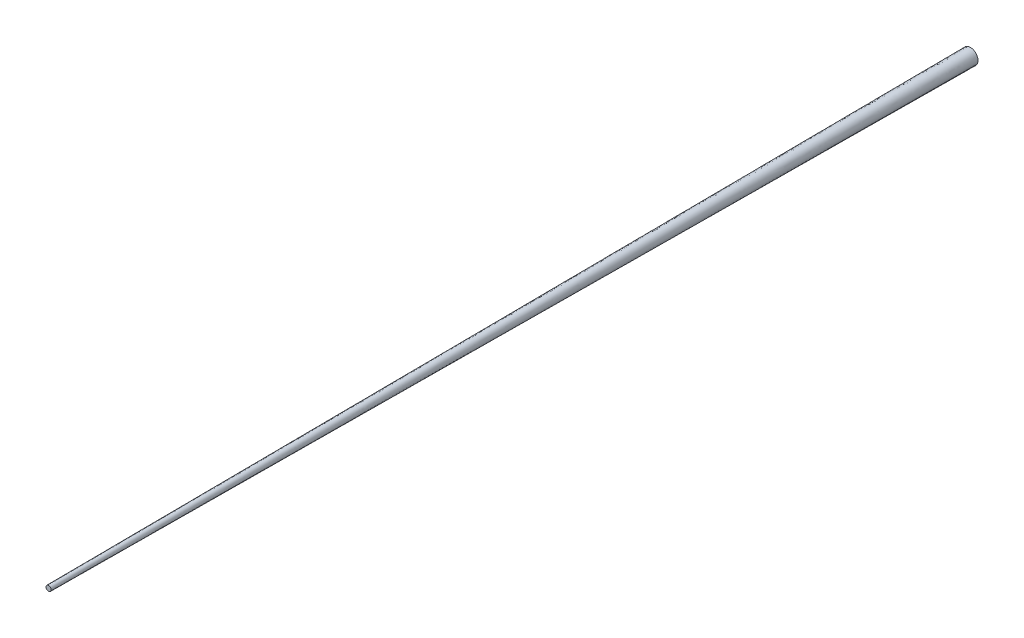
ISO-10303-21;
HEADER;
FILE_DESCRIPTION(('STEP AP214'),'2;1');
FILE_NAME('part.step','',(''),(''),'','','');
FILE_SCHEMA(('AUTOMOTIVE_DESIGN { 1 0 10303 214 1 1 1 1 }'));
ENDSEC;
DATA;
#1=APPLICATION_CONTEXT('core data for automotive mechanical design processes');
#2=APPLICATION_PROTOCOL_DEFINITION('international standard','automotive_design',2000,#1);
#3=PRODUCT_CONTEXT('',#1,'mechanical');
#4=PRODUCT('Part','Part','',(#3));
#5=PRODUCT_RELATED_PRODUCT_CATEGORY('part','',(#4));
#6=PRODUCT_DEFINITION_FORMATION('','',#4);
#7=PRODUCT_DEFINITION_CONTEXT('part definition',#1,'design');
#8=PRODUCT_DEFINITION('design','',#6,#7);
#9=PRODUCT_DEFINITION_SHAPE('','',#8);
#10=(LENGTH_UNIT() NAMED_UNIT(*) SI_UNIT(.MILLI.,.METRE.));
#11=(NAMED_UNIT(*) PLANE_ANGLE_UNIT() SI_UNIT($,.RADIAN.));
#12=(NAMED_UNIT(*) SI_UNIT($,.STERADIAN.) SOLID_ANGLE_UNIT());
#13=UNCERTAINTY_MEASURE_WITH_UNIT(LENGTH_MEASURE(1.E-05),#10,'distance_accuracy_value','');
#14=(GEOMETRIC_REPRESENTATION_CONTEXT(3) GLOBAL_UNCERTAINTY_ASSIGNED_CONTEXT((#13)) GLOBAL_UNIT_ASSIGNED_CONTEXT((#10,
#11,#12)) REPRESENTATION_CONTEXT('',''));
#15=CARTESIAN_POINT('',(0.,0.,0.));
#16=DIRECTION('',(0.,0.,1.));
#17=DIRECTION('',(1.,0.,0.));
#18=AXIS2_PLACEMENT_3D('',#15,#16,#17);
#19=CARTESIAN_POINT('',(0.,0.,31.));
#20=DIRECTION('',(0.,0.,1.));
#21=DIRECTION('',(1.,0.,0.));
#22=AXIS2_PLACEMENT_3D('',#19,#20,#21);
#23=PLANE('',#22);
#24=CARTESIAN_POINT('',(0.,0.,31.));
#25=DIRECTION('',(0.,0.,1.));
#26=DIRECTION('',(1.,0.,0.));
#27=AXIS2_PLACEMENT_3D('',#24,#25,#26);
#28=CIRCLE('',#27,1.5);
#29=CARTESIAN_POINT('',(1.30248005570267,-0.744006521810648,31.));
#30=VERTEX_POINT('',#29);
#31=EDGE_CURVE('E11',#30,#30,#28,.T.);
#32=ORIENTED_EDGE('',*,*,#31,.F.);
#33=EDGE_LOOP('',(#32));
#34=FACE_BOUND('',#33,.T.);
#35=ADVANCED_FACE('F41',(#34),#23,.F.);
#36=CARTESIAN_POINT('',(0.,0.,212.5));
#37=DIRECTION('',(0.,0.,1.));
#38=DIRECTION('',(1.,0.,0.));
#39=AXIS2_PLACEMENT_3D('',#36,#37,#38);
#40=PLANE('',#39);
#41=CARTESIAN_POINT('',(0.,0.,212.5));
#42=DIRECTION('',(0.,0.,1.));
#43=DIRECTION('',(1.,0.,0.));
#44=AXIS2_PLACEMENT_3D('',#41,#42,#43);
#45=CIRCLE('',#44,0.499999999999966);
#46=CARTESIAN_POINT('',(0.305459621935444,-0.395846459333693,212.5));
#47=VERTEX_POINT('',#46);
#48=EDGE_CURVE('E49',#47,#47,#45,.T.);
#49=ORIENTED_EDGE('',*,*,#48,.T.);
#50=EDGE_LOOP('',(#49));
#51=FACE_BOUND('',#50,.T.);
#52=ADVANCED_FACE('F73',(#51),#40,.T.);
#53=CARTESIAN_POINT('',(0.305459621935444,-0.395846459333693,212.5));
#54=CARTESIAN_POINT('',(1.30248005570267,-0.744006521810648,31.));
#55=CARTESIAN_POINT('',(-0.486233296731943,-1.00676570320458,212.5));
#56=CARTESIAN_POINT('',(-0.185532987918629,-3.34896663321598,31.));
#57=CARTESIAN_POINT('',(-1.09715254060283,-0.215072784537195,212.5));
#58=CARTESIAN_POINT('',(-2.79049309932396,-1.86095358959469,31.));
#59=CARTESIAN_POINT('',(-0.305459621935444,0.395846459333693,212.5));
#60=CARTESIAN_POINT('',(-1.30248005570267,0.744006521810648,31.));
#61=CARTESIAN_POINT('',(0.486233296731942,1.00676570320458,212.5));
#62=CARTESIAN_POINT('',(0.18553298791863,3.34896663321598,31.));
#63=CARTESIAN_POINT('',(1.09715254060283,0.215072784537195,212.5));
#64=CARTESIAN_POINT('',(2.79049309932397,1.86095358959468,31.));
#65=CARTESIAN_POINT('',(0.305459621935444,-0.395846459333693,212.5));
#66=CARTESIAN_POINT('',(1.30248005570267,-0.744006521810648,31.));
#67=(BOUNDED_SURFACE() B_SPLINE_SURFACE(3,1,((#53,#54),(#55,#56),(#57,#58),(#59,#60),(#61,#62),
(#63,#64),(#65,#66)),.UNSPECIFIED.,.T.,.F.,.F.) B_SPLINE_SURFACE_WITH_KNOTS((4,3,4),(2,2),(0.,
0.5,1.),(0.,1.),.UNSPECIFIED.) GEOMETRIC_REPRESENTATION_ITEM() RATIONAL_B_SPLINE_SURFACE(((1.,
1.),(0.333333333333333,0.333333333333333),(0.333333333333333,0.333333333333333),(1.,1.),
(0.333333333333334,0.333333333333333),(0.333333333333334,0.333333333333333),(1.,1.))) REPRESENTATION_ITEM('') SURFACE());
#68=CARTESIAN_POINT('',(0.305459621935444,-0.395846459333693,212.5));
#69=CARTESIAN_POINT('',(0.315845251453853,-0.399473126651162,210.609375));
#70=CARTESIAN_POINT('',(0.326230880972261,-0.40309979396863,208.71875));
#71=CARTESIAN_POINT('',(0.347002140009078,-0.410353128603567,204.9375));
#72=CARTESIAN_POINT('',(0.357387769527487,-0.413979795921035,203.046875));
#73=CARTESIAN_POINT('',(0.378159028564304,-0.421233130555971,199.265625));
#74=CARTESIAN_POINT('',(0.388544658082713,-0.42485979787344,197.375));
#75=CARTESIAN_POINT('',(0.40931591711953,-0.432113132508376,193.59375));
#76=CARTESIAN_POINT('',(0.419701546637938,-0.435739799825844,191.703125));
#77=CARTESIAN_POINT('',(0.440472805674755,-0.442993134460781,187.921875));
#78=CARTESIAN_POINT('',(0.450858435193164,-0.446619801778249,186.03125));
#79=CARTESIAN_POINT('',(0.471629694229981,-0.453873136413186,182.25));
#80=CARTESIAN_POINT('',(0.48201532374839,-0.457499803730654,180.359375));
#81=CARTESIAN_POINT('',(0.502786582785207,-0.464753138365591,176.578125));
#82=CARTESIAN_POINT('',(0.513172212303616,-0.468379805683059,174.6875));
#83=CARTESIAN_POINT('',(0.533943471340433,-0.475633140317996,170.90625));
#84=CARTESIAN_POINT('',(0.544329100858841,-0.479259807635464,169.015625));
#85=CARTESIAN_POINT('',(0.565100359895658,-0.4865131422704,165.234375));
#86=CARTESIAN_POINT('',(0.575485989414067,-0.490139809587869,163.34375));
#87=CARTESIAN_POINT('',(0.596257248450884,-0.497393144222805,159.5625));
#88=CARTESIAN_POINT('',(0.606642877969293,-0.501019811540274,157.671875));
#89=CARTESIAN_POINT('',(0.62741413700611,-0.50827314617521,153.890625));
#90=CARTESIAN_POINT('',(0.637799766524518,-0.511899813492678,152.));
#91=CARTESIAN_POINT('',(0.658571025561335,-0.519153148127615,148.21875));
#92=CARTESIAN_POINT('',(0.668956655079744,-0.522779815445083,146.328125));
#93=CARTESIAN_POINT('',(0.689727914116561,-0.53003315008002,142.546875));
#94=CARTESIAN_POINT('',(0.70011354363497,-0.533659817397488,140.65625));
#95=CARTESIAN_POINT('',(0.720884802671787,-0.540913152032425,136.875));
#96=CARTESIAN_POINT('',(0.731270432190195,-0.544539819349893,134.984375));
#97=CARTESIAN_POINT('',(0.752041691227013,-0.551793153984829,131.203125));
#98=CARTESIAN_POINT('',(0.762427320745421,-0.555419821302298,129.3125));
#99=CARTESIAN_POINT('',(0.783198579782238,-0.562673155937234,125.53125));
#100=CARTESIAN_POINT('',(0.793584209300647,-0.566299823254703,123.640625));
#101=CARTESIAN_POINT('',(0.814355468337464,-0.573553157889639,119.859375));
#102=CARTESIAN_POINT('',(0.824741097855873,-0.577179825207107,117.96875));
#103=CARTESIAN_POINT('',(0.84551235689269,-0.584433159842044,114.1875));
#104=CARTESIAN_POINT('',(0.855897986411098,-0.588059827159512,112.296875));
#105=CARTESIAN_POINT('',(0.876669245447915,-0.595313161794449,108.515625));
#106=CARTESIAN_POINT('',(0.887054874966324,-0.598939829111917,106.625));
#107=CARTESIAN_POINT('',(0.907826134003141,-0.606193163746854,102.84375));
#108=CARTESIAN_POINT('',(0.91821176352155,-0.609819831064322,100.953125));
#109=CARTESIAN_POINT('',(0.938983022558367,-0.617073165699258,97.171875));
#110=CARTESIAN_POINT('',(0.949368652076776,-0.620699833016727,95.28125));
#111=CARTESIAN_POINT('',(0.970139911113593,-0.627953167651663,91.5));
#112=CARTESIAN_POINT('',(0.980525540632001,-0.631579834969132,89.609375));
#113=CARTESIAN_POINT('',(1.00129679966882,-0.638833169604068,85.828125));
#114=CARTESIAN_POINT('',(1.01168242918723,-0.642459836921536,83.9375));
#115=CARTESIAN_POINT('',(1.03245368822404,-0.649713171556473,80.15625));
#116=CARTESIAN_POINT('',(1.04283931774245,-0.653339838873941,78.265625));
#117=CARTESIAN_POINT('',(1.06361057677927,-0.660593173508878,74.484375));
#118=CARTESIAN_POINT('',(1.07399620629768,-0.664219840826346,72.59375));
#119=CARTESIAN_POINT('',(1.0947674653345,-0.671473175461283,68.8125));
#120=CARTESIAN_POINT('',(1.1051530948529,-0.675099842778751,66.921875));
#121=CARTESIAN_POINT('',(1.12592435388972,-0.682353177413688,63.140625));
#122=CARTESIAN_POINT('',(1.13630998340813,-0.685979844731156,61.25));
#123=CARTESIAN_POINT('',(1.15708124244495,-0.693233179366092,57.46875));
#124=CARTESIAN_POINT('',(1.16746687196336,-0.696859846683561,55.578125));
#125=CARTESIAN_POINT('',(1.18823813100017,-0.704113181318497,51.796875));
#126=CARTESIAN_POINT('',(1.19862376051858,-0.707739848635965,49.90625));
#127=CARTESIAN_POINT('',(1.2193950195554,-0.714993183270902,46.125));
#128=CARTESIAN_POINT('',(1.22978064907381,-0.71861985058837,44.234375));
#129=CARTESIAN_POINT('',(1.25055190811062,-0.725873185223307,40.453125));
#130=CARTESIAN_POINT('',(1.26093753762903,-0.729499852540775,38.5625));
#131=CARTESIAN_POINT('',(1.28170879666585,-0.736753187175712,34.78125));
#132=CARTESIAN_POINT('',(1.29209442618426,-0.74037985449318,32.890625));
#133=CARTESIAN_POINT('',(1.30248005570267,-0.744006521810648,31.));
#134=B_SPLINE_CURVE_WITH_KNOTS('',3,(#68,#69,#70,#71,#72,#73,#74,#75,#76,#77,#78,#79,#80,#81,
#82,#83,#84,#85,#86,#87,#88,#89,#90,#91,#92,#93,#94,#95,#96,#97,#98,#99,#100,#101,#102,#103,
#104,#105,#106,#107,#108,#109,#110,#111,#112,#113,#114,#115,#116,#117,#118,#119,#120,#121,#122,
#123,#124,#125,#126,#127,#128,#129,#130,#131,#132,#133),.UNSPECIFIED.,.F.,.F.,(4,2,2,2,2,2,2,2,
2,2,2,2,2,2,2,2,2,2,2,2,2,2,2,2,2,2,2,2,2,2,2,2,4),(0.,5.67197101030781,11.3439420206156,
17.0159130309234,22.6878840412311,28.3598550515389,34.0318260618467,39.7037970721545,
45.3757680824623,51.0477390927701,56.7197101030779,62.3916811133857,68.0636521236934,
73.7356231340012,79.407594144309,85.0795651546168,90.7515361649246,96.4235071752324,
102.09547818554,107.767449195848,113.439420206156,119.111391216464,124.783362226771,
130.455333237079,136.127304247387,141.799275257695,147.471246268002,153.14321727831,
158.815188288618,164.487159298926,170.159130309234,175.831101319541,181.503072329849),.UNSPECIFIED.);
#135=EDGE_CURVE('BSEAM81',#47,#30,#134,.T.);
#136=ORIENTED_EDGE('',*,*,#48,.F.);
#137=ORIENTED_EDGE('',*,*,#31,.T.);
#138=ORIENTED_EDGE('',*,*,#135,.T.);
#139=ORIENTED_EDGE('',*,*,#135,.F.);
#140=EDGE_LOOP('',(#136,#138,#137,#139));
#141=FACE_BOUND('',#140,.T.);
#142=ADVANCED_FACE('F81',(#141),#67,.T.);
#143=CLOSED_SHELL('',(#35,#52,#142));
#144=MANIFOLD_SOLID_BREP('B2',#143);
#145=ADVANCED_BREP_SHAPE_REPRESENTATION('',(#18,#144),#14);
#146=SHAPE_DEFINITION_REPRESENTATION(#9,#145);
ENDSEC;
END-ISO-10303-21;
